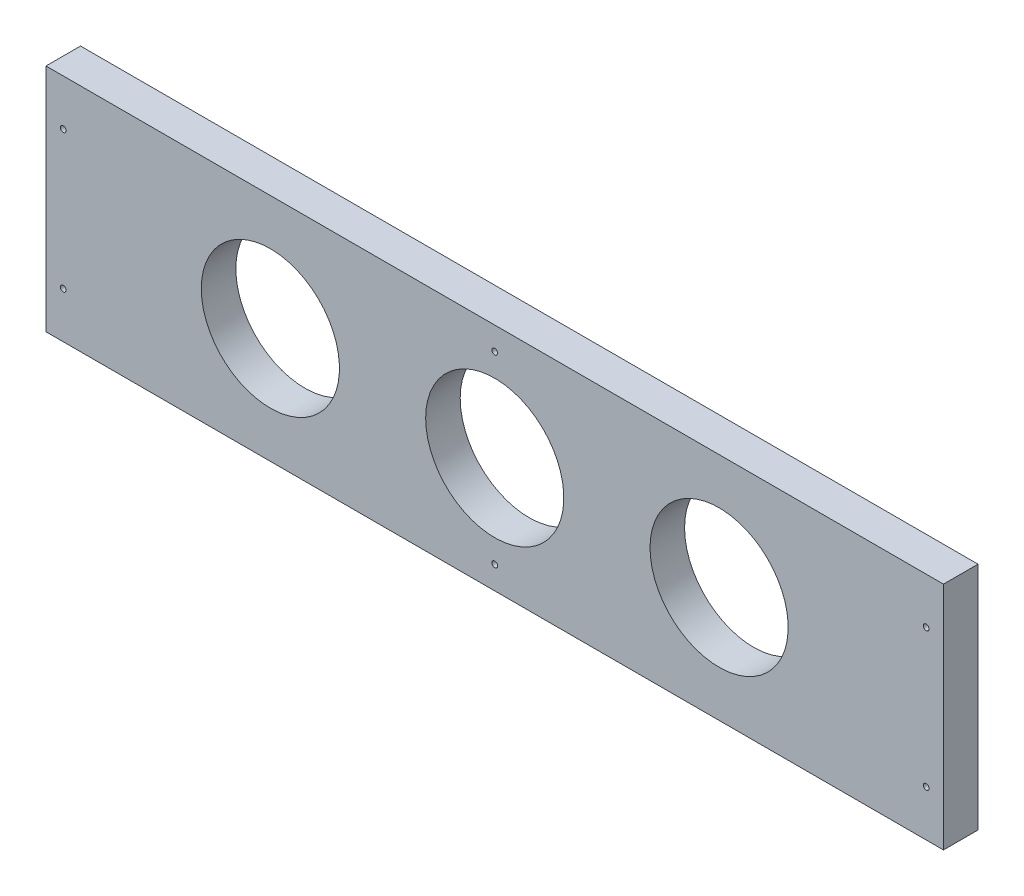
ISO-10303-21;
HEADER;
FILE_DESCRIPTION(('STEP AP214'),'2;1');
FILE_NAME('part.step','',(''),(''),'','','');
FILE_SCHEMA(('AUTOMOTIVE_DESIGN { 1 0 10303 214 1 1 1 1 }'));
ENDSEC;
DATA;
#1=APPLICATION_CONTEXT('core data for automotive mechanical design processes');
#2=APPLICATION_PROTOCOL_DEFINITION('international standard','automotive_design',2000,#1);
#3=PRODUCT_CONTEXT('',#1,'mechanical');
#4=PRODUCT('Part','Part','',(#3));
#5=PRODUCT_RELATED_PRODUCT_CATEGORY('part','',(#4));
#6=PRODUCT_DEFINITION_FORMATION('','',#4);
#7=PRODUCT_DEFINITION_CONTEXT('part definition',#1,'design');
#8=PRODUCT_DEFINITION('design','',#6,#7);
#9=PRODUCT_DEFINITION_SHAPE('','',#8);
#10=(LENGTH_UNIT() NAMED_UNIT(*) SI_UNIT(.MILLI.,.METRE.));
#11=(NAMED_UNIT(*) PLANE_ANGLE_UNIT() SI_UNIT($,.RADIAN.));
#12=(NAMED_UNIT(*) SI_UNIT($,.STERADIAN.) SOLID_ANGLE_UNIT());
#13=UNCERTAINTY_MEASURE_WITH_UNIT(LENGTH_MEASURE(1.E-05),#10,'distance_accuracy_value','');
#14=(GEOMETRIC_REPRESENTATION_CONTEXT(3) GLOBAL_UNCERTAINTY_ASSIGNED_CONTEXT((#13)) GLOBAL_UNIT_ASSIGNED_CONTEXT((#10,
#11,#12)) REPRESENTATION_CONTEXT('',''));
#15=CARTESIAN_POINT('',(0.,0.,0.));
#16=DIRECTION('',(0.,0.,1.));
#17=DIRECTION('',(1.,0.,0.));
#18=AXIS2_PLACEMENT_3D('',#15,#16,#17);
#19=CARTESIAN_POINT('',(-157.326601488341,5411.8315292923,19.05));
#20=DIRECTION('',(1.,0.,0.));
#21=DIRECTION('',(0.,0.,-1.));
#22=AXIS2_PLACEMENT_3D('',#19,#20,#21);
#23=PLANE('',#22);
#24=DIRECTION('',(0.,-1.,0.));
#25=VECTOR('',#24,1.);
#26=CARTESIAN_POINT('',(-157.326601488341,5411.8315292923,0.));
#27=LINE('',#26,#25);
#28=CARTESIAN_POINT('',(-157.326601488341,5411.8315292923,0.));
#29=VERTEX_POINT('',#28);
#30=CARTESIAN_POINT('',(-157.326601488341,5284.8315292923,0.));
#31=VERTEX_POINT('',#30);
#32=EDGE_CURVE('E98',#29,#31,#27,.T.);
#33=ORIENTED_EDGE('',*,*,#32,.T.);
#34=DIRECTION('',(0.,0.,-1.));
#35=VECTOR('',#34,1.);
#36=CARTESIAN_POINT('',(-157.326601488341,5284.8315292923,19.05));
#37=LINE('',#36,#35);
#38=CARTESIAN_POINT('',(-157.326601488341,5284.8315292923,19.05));
#39=VERTEX_POINT('',#38);
#40=EDGE_CURVE('E11',#39,#31,#37,.T.);
#41=ORIENTED_EDGE('',*,*,#40,.F.);
#42=DIRECTION('',(0.,-1.,0.));
#43=VECTOR('',#42,1.);
#44=CARTESIAN_POINT('',(-157.326601488341,5411.8315292923,19.05));
#45=LINE('',#44,#43);
#46=CARTESIAN_POINT('',(-157.326601488341,5411.8315292923,19.05));
#47=VERTEX_POINT('',#46);
#48=EDGE_CURVE('E85',#47,#39,#45,.T.);
#49=ORIENTED_EDGE('',*,*,#48,.F.);
#50=DIRECTION('',(0.,0.,-1.));
#51=VECTOR('',#50,1.);
#52=CARTESIAN_POINT('',(-157.326601488341,5411.8315292923,19.05));
#53=LINE('',#52,#51);
#54=EDGE_CURVE('E94',#47,#29,#53,.T.);
#55=ORIENTED_EDGE('',*,*,#54,.T.);
#56=EDGE_LOOP('',(#33,#41,#49,#55));
#57=FACE_BOUND('',#56,.T.);
#58=ADVANCED_FACE('F32',(#57),#23,.F.);
#59=CARTESIAN_POINT('',(-157.326601488341,5284.8315292923,19.05));
#60=DIRECTION('',(0.,1.,0.));
#61=DIRECTION('',(0.,0.,1.));
#62=AXIS2_PLACEMENT_3D('',#59,#60,#61);
#63=PLANE('',#62);
#64=DIRECTION('',(1.,0.,0.));
#65=VECTOR('',#64,1.);
#66=CARTESIAN_POINT('',(-157.326601488341,5284.8315292923,0.));
#67=LINE('',#66,#65);
#68=CARTESIAN_POINT('',(337.719398511659,5284.8315292923,0.));
#69=VERTEX_POINT('',#68);
#70=EDGE_CURVE('E89',#31,#69,#67,.T.);
#71=ORIENTED_EDGE('',*,*,#70,.T.);
#72=DIRECTION('',(0.,0.,-1.));
#73=VECTOR('',#72,1.);
#74=CARTESIAN_POINT('',(337.719398511659,5284.8315292923,19.05));
#75=LINE('',#74,#73);
#76=CARTESIAN_POINT('',(337.719398511659,5284.8315292923,19.05));
#77=VERTEX_POINT('',#76);
#78=EDGE_CURVE('E41',#77,#69,#75,.T.);
#79=ORIENTED_EDGE('',*,*,#78,.F.);
#80=DIRECTION('',(1.,0.,0.));
#81=VECTOR('',#80,1.);
#82=CARTESIAN_POINT('',(-157.326601488341,5284.8315292923,19.05));
#83=LINE('',#82,#81);
#84=EDGE_CURVE('E80',#39,#77,#83,.T.);
#85=ORIENTED_EDGE('',*,*,#84,.F.);
#86=ORIENTED_EDGE('',*,*,#40,.T.);
#87=EDGE_LOOP('',(#71,#79,#85,#86));
#88=FACE_BOUND('',#87,.T.);
#89=ADVANCED_FACE('F88',(#88),#63,.F.);
#90=CARTESIAN_POINT('',(337.719398511659,5411.8315292923,19.05));
#91=DIRECTION('',(-1.,0.,0.));
#92=DIRECTION('',(0.,0.,1.));
#93=AXIS2_PLACEMENT_3D('',#90,#91,#92);
#94=PLANE('',#93);
#95=DIRECTION('',(0.,1.,0.));
#96=VECTOR('',#95,1.);
#97=CARTESIAN_POINT('',(337.719398511659,5411.8315292923,0.));
#98=LINE('',#97,#96);
#99=CARTESIAN_POINT('',(337.719398511659,5411.8315292923,0.));
#100=VERTEX_POINT('',#99);
#101=EDGE_CURVE('E67',#69,#100,#98,.T.);
#102=ORIENTED_EDGE('',*,*,#101,.T.);
#103=DIRECTION('',(0.,0.,-1.));
#104=VECTOR('',#103,1.);
#105=CARTESIAN_POINT('',(337.719398511659,5411.8315292923,19.05));
#106=LINE('',#105,#104);
#107=CARTESIAN_POINT('',(337.719398511659,5411.8315292923,19.05));
#108=VERTEX_POINT('',#107);
#109=EDGE_CURVE('E90',#108,#100,#106,.T.);
#110=ORIENTED_EDGE('',*,*,#109,.F.);
#111=DIRECTION('',(0.,1.,0.));
#112=VECTOR('',#111,1.);
#113=CARTESIAN_POINT('',(337.719398511659,5411.8315292923,19.05));
#114=LINE('',#113,#112);
#115=EDGE_CURVE('E83',#77,#108,#114,.T.);
#116=ORIENTED_EDGE('',*,*,#115,.F.);
#117=ORIENTED_EDGE('',*,*,#78,.T.);
#118=EDGE_LOOP('',(#102,#110,#116,#117));
#119=FACE_BOUND('',#118,.T.);
#120=ADVANCED_FACE('F92',(#119),#94,.F.);
#121=CARTESIAN_POINT('',(-157.326601488341,5411.8315292923,19.05));
#122=DIRECTION('',(0.,-1.,0.));
#123=DIRECTION('',(0.,0.,-1.));
#124=AXIS2_PLACEMENT_3D('',#121,#122,#123);
#125=PLANE('',#124);
#126=DIRECTION('',(-1.,0.,0.));
#127=VECTOR('',#126,1.);
#128=CARTESIAN_POINT('',(-157.326601488341,5411.8315292923,0.));
#129=LINE('',#128,#127);
#130=EDGE_CURVE('E73',#100,#29,#129,.T.);
#131=ORIENTED_EDGE('',*,*,#130,.T.);
#132=ORIENTED_EDGE('',*,*,#54,.F.);
#133=DIRECTION('',(-1.,0.,0.));
#134=VECTOR('',#133,1.);
#135=CARTESIAN_POINT('',(-157.326601488341,5411.8315292923,19.05));
#136=LINE('',#135,#134);
#137=EDGE_CURVE('E50',#108,#47,#136,.T.);
#138=ORIENTED_EDGE('',*,*,#137,.F.);
#139=ORIENTED_EDGE('',*,*,#109,.T.);
#140=EDGE_LOOP('',(#131,#132,#138,#139));
#141=FACE_BOUND('',#140,.T.);
#142=ADVANCED_FACE('F171',(#141),#125,.F.);
#143=CARTESIAN_POINT('',(0.,0.,19.05));
#144=DIRECTION('',(0.,0.,1.));
#145=DIRECTION('',(1.,0.,0.));
#146=AXIS2_PLACEMENT_3D('',#143,#144,#145);
#147=PLANE('',#146);
#148=CARTESIAN_POINT('',(-147.801601488341,5386.4315292923,19.05));
#149=DIRECTION('',(0.,0.,1.));
#150=DIRECTION('',(1.,0.,0.));
#151=AXIS2_PLACEMENT_3D('',#148,#149,#150);
#152=CIRCLE('',#151,1.58749999999999);
#153=CARTESIAN_POINT('',(-146.214101488341,5386.4315292923,19.05));
#154=VERTEX_POINT('',#153);
#155=EDGE_CURVE('E125',#154,#154,#152,.T.);
#156=ORIENTED_EDGE('',*,*,#155,.F.);
#157=EDGE_LOOP('',(#156));
#158=FACE_BOUND('',#157,.T.);
#159=CARTESIAN_POINT('',(-147.801601488341,5310.23152929229,19.05));
#160=DIRECTION('',(0.,0.,1.));
#161=DIRECTION('',(1.,0.,0.));
#162=AXIS2_PLACEMENT_3D('',#159,#160,#161);
#163=CIRCLE('',#162,1.58749999999999);
#164=CARTESIAN_POINT('',(-146.214101488341,5310.23152929229,19.05));
#165=VERTEX_POINT('',#164);
#166=EDGE_CURVE('E122',#165,#165,#163,.T.);
#167=ORIENTED_EDGE('',*,*,#166,.F.);
#168=EDGE_LOOP('',(#167));
#169=FACE_BOUND('',#168,.T.);
#170=CARTESIAN_POINT('',(328.194398511659,5310.23152929229,19.05));
#171=DIRECTION('',(0.,0.,1.));
#172=DIRECTION('',(1.,0.,0.));
#173=AXIS2_PLACEMENT_3D('',#170,#171,#172);
#174=CIRCLE('',#173,1.58750000000002);
#175=CARTESIAN_POINT('',(329.781898511659,5310.23152929229,19.05));
#176=VERTEX_POINT('',#175);
#177=EDGE_CURVE('E119',#176,#176,#174,.T.);
#178=ORIENTED_EDGE('',*,*,#177,.F.);
#179=EDGE_LOOP('',(#178));
#180=FACE_BOUND('',#179,.T.);
#181=CARTESIAN_POINT('',(328.194398511659,5386.4315292923,19.05));
#182=DIRECTION('',(0.,0.,1.));
#183=DIRECTION('',(1.,0.,0.));
#184=AXIS2_PLACEMENT_3D('',#181,#182,#183);
#185=CIRCLE('',#184,1.58750000000002);
#186=CARTESIAN_POINT('',(329.781898511659,5386.4315292923,19.05));
#187=VERTEX_POINT('',#186);
#188=EDGE_CURVE('E115',#187,#187,#185,.T.);
#189=ORIENTED_EDGE('',*,*,#188,.F.);
#190=EDGE_LOOP('',(#189));
#191=FACE_BOUND('',#190,.T.);
#192=CARTESIAN_POINT('',(90.1963985116595,5399.1315292923,19.05));
#193=DIRECTION('',(0.,0.,1.));
#194=DIRECTION('',(1.,0.,0.));
#195=AXIS2_PLACEMENT_3D('',#192,#193,#194);
#196=CIRCLE('',#195,1.58750000000001);
#197=CARTESIAN_POINT('',(91.7838985116595,5399.1315292923,19.05));
#198=VERTEX_POINT('',#197);
#199=EDGE_CURVE('E111',#198,#198,#196,.T.);
#200=ORIENTED_EDGE('',*,*,#199,.F.);
#201=EDGE_LOOP('',(#200));
#202=FACE_BOUND('',#201,.T.);
#203=CARTESIAN_POINT('',(90.1963985116595,5297.5315292923,19.05));
#204=DIRECTION('',(0.,0.,1.));
#205=DIRECTION('',(1.,0.,0.));
#206=AXIS2_PLACEMENT_3D('',#203,#204,#205);
#207=CIRCLE('',#206,1.5875);
#208=CARTESIAN_POINT('',(91.7838985116595,5297.5315292923,19.05));
#209=VERTEX_POINT('',#208);
#210=EDGE_CURVE('E110',#209,#209,#207,.T.);
#211=ORIENTED_EDGE('',*,*,#210,.F.);
#212=EDGE_LOOP('',(#211));
#213=FACE_BOUND('',#212,.T.);
#214=CARTESIAN_POINT('',(213.957898511659,5348.3315292923,19.05));
#215=DIRECTION('',(0.,0.,-1.));
#216=DIRECTION('',(-1.,0.,0.));
#217=AXIS2_PLACEMENT_3D('',#214,#215,#216);
#218=CIRCLE('',#217,38.1000000000004);
#219=CARTESIAN_POINT('',(175.857898511659,5348.3315292923,19.05));
#220=VERTEX_POINT('',#219);
#221=EDGE_CURVE('E101',#220,#220,#218,.T.);
#222=ORIENTED_EDGE('',*,*,#221,.T.);
#223=EDGE_LOOP('',(#222));
#224=FACE_BOUND('',#223,.T.);
#225=CARTESIAN_POINT('',(90.1963985116592,5348.3315292923,19.05));
#226=DIRECTION('',(0.,0.,-1.));
#227=DIRECTION('',(-1.,0.,0.));
#228=AXIS2_PLACEMENT_3D('',#225,#226,#227);
#229=CIRCLE('',#228,38.1000000000001);
#230=CARTESIAN_POINT('',(52.0963985116591,5348.3315292923,19.05));
#231=VERTEX_POINT('',#230);
#232=EDGE_CURVE('E150',#231,#231,#229,.T.);
#233=ORIENTED_EDGE('',*,*,#232,.T.);
#234=EDGE_LOOP('',(#233));
#235=FACE_BOUND('',#234,.T.);
#236=CARTESIAN_POINT('',(-33.565101488341,5348.3315292923,19.05));
#237=DIRECTION('',(0.,0.,-1.));
#238=DIRECTION('',(1.,0.,0.));
#239=AXIS2_PLACEMENT_3D('',#236,#237,#238);
#240=CIRCLE('',#239,38.1000000000004);
#241=CARTESIAN_POINT('',(-71.6651014883413,5348.3315292923,19.05));
#242=VERTEX_POINT('',#241);
#243=EDGE_CURVE('E156',#242,#242,#240,.T.);
#244=ORIENTED_EDGE('',*,*,#243,.T.);
#245=EDGE_LOOP('',(#244));
#246=FACE_BOUND('',#245,.T.);
#247=ORIENTED_EDGE('',*,*,#48,.T.);
#248=ORIENTED_EDGE('',*,*,#84,.T.);
#249=ORIENTED_EDGE('',*,*,#115,.T.);
#250=ORIENTED_EDGE('',*,*,#137,.T.);
#251=EDGE_LOOP('',(#247,#248,#249,#250));
#252=FACE_BOUND('',#251,.T.);
#253=ADVANCED_FACE('F81',(#158,#169,#180,#191,#202,#213,#224,#235,#246,#252),#147,.T.);
#254=CARTESIAN_POINT('',(0.,0.,0.));
#255=DIRECTION('',(0.,0.,1.));
#256=DIRECTION('',(1.,0.,0.));
#257=AXIS2_PLACEMENT_3D('',#254,#255,#256);
#258=PLANE('',#257);
#259=CARTESIAN_POINT('',(-147.801601488341,5386.4315292923,0.));
#260=DIRECTION('',(0.,0.,1.));
#261=DIRECTION('',(1.,0.,0.));
#262=AXIS2_PLACEMENT_3D('',#259,#260,#261);
#263=CIRCLE('',#262,1.58749999999999);
#264=CARTESIAN_POINT('',(-146.214101488341,5386.4315292923,0.));
#265=VERTEX_POINT('',#264);
#266=EDGE_CURVE('E35',#265,#265,#263,.T.);
#267=ORIENTED_EDGE('',*,*,#266,.T.);
#268=EDGE_LOOP('',(#267));
#269=FACE_BOUND('',#268,.T.);
#270=CARTESIAN_POINT('',(-147.801601488341,5310.23152929229,0.));
#271=DIRECTION('',(0.,0.,1.));
#272=DIRECTION('',(1.,0.,0.));
#273=AXIS2_PLACEMENT_3D('',#270,#271,#272);
#274=CIRCLE('',#273,1.58749999999999);
#275=CARTESIAN_POINT('',(-146.214101488341,5310.23152929229,0.));
#276=VERTEX_POINT('',#275);
#277=EDGE_CURVE('E123',#276,#276,#274,.T.);
#278=ORIENTED_EDGE('',*,*,#277,.T.);
#279=EDGE_LOOP('',(#278));
#280=FACE_BOUND('',#279,.T.);
#281=CARTESIAN_POINT('',(328.194398511659,5310.23152929229,0.));
#282=DIRECTION('',(0.,0.,1.));
#283=DIRECTION('',(1.,0.,0.));
#284=AXIS2_PLACEMENT_3D('',#281,#282,#283);
#285=CIRCLE('',#284,1.58750000000002);
#286=CARTESIAN_POINT('',(329.781898511659,5310.23152929229,0.));
#287=VERTEX_POINT('',#286);
#288=EDGE_CURVE('E120',#287,#287,#285,.T.);
#289=ORIENTED_EDGE('',*,*,#288,.T.);
#290=EDGE_LOOP('',(#289));
#291=FACE_BOUND('',#290,.T.);
#292=CARTESIAN_POINT('',(328.194398511659,5386.4315292923,0.));
#293=DIRECTION('',(0.,0.,1.));
#294=DIRECTION('',(1.,0.,0.));
#295=AXIS2_PLACEMENT_3D('',#292,#293,#294);
#296=CIRCLE('',#295,1.58750000000002);
#297=CARTESIAN_POINT('',(329.781898511659,5386.4315292923,0.));
#298=VERTEX_POINT('',#297);
#299=EDGE_CURVE('E116',#298,#298,#296,.T.);
#300=ORIENTED_EDGE('',*,*,#299,.T.);
#301=EDGE_LOOP('',(#300));
#302=FACE_BOUND('',#301,.T.);
#303=CARTESIAN_POINT('',(90.1963985116595,5399.1315292923,0.));
#304=DIRECTION('',(0.,0.,1.));
#305=DIRECTION('',(1.,0.,0.));
#306=AXIS2_PLACEMENT_3D('',#303,#304,#305);
#307=CIRCLE('',#306,1.58750000000001);
#308=CARTESIAN_POINT('',(91.7838985116595,5399.1315292923,0.));
#309=VERTEX_POINT('',#308);
#310=EDGE_CURVE('E112',#309,#309,#307,.T.);
#311=ORIENTED_EDGE('',*,*,#310,.T.);
#312=EDGE_LOOP('',(#311));
#313=FACE_BOUND('',#312,.T.);
#314=CARTESIAN_POINT('',(90.1963985116595,5297.5315292923,0.));
#315=DIRECTION('',(0.,0.,1.));
#316=DIRECTION('',(1.,0.,0.));
#317=AXIS2_PLACEMENT_3D('',#314,#315,#316);
#318=CIRCLE('',#317,1.5875);
#319=CARTESIAN_POINT('',(91.7838985116595,5297.5315292923,0.));
#320=VERTEX_POINT('',#319);
#321=EDGE_CURVE('E107',#320,#320,#318,.T.);
#322=ORIENTED_EDGE('',*,*,#321,.T.);
#323=EDGE_LOOP('',(#322));
#324=FACE_BOUND('',#323,.T.);
#325=CARTESIAN_POINT('',(213.957898511659,5348.3315292923,0.));
#326=DIRECTION('',(0.,0.,-1.));
#327=DIRECTION('',(-1.,0.,0.));
#328=AXIS2_PLACEMENT_3D('',#325,#326,#327);
#329=CIRCLE('',#328,38.1000000000004);
#330=CARTESIAN_POINT('',(175.857898511659,5348.3315292923,0.));
#331=VERTEX_POINT('',#330);
#332=EDGE_CURVE('E147',#331,#331,#329,.T.);
#333=ORIENTED_EDGE('',*,*,#332,.F.);
#334=EDGE_LOOP('',(#333));
#335=FACE_BOUND('',#334,.T.);
#336=CARTESIAN_POINT('',(90.1963985116592,5348.3315292923,0.));
#337=DIRECTION('',(0.,0.,-1.));
#338=DIRECTION('',(-1.,0.,0.));
#339=AXIS2_PLACEMENT_3D('',#336,#337,#338);
#340=CIRCLE('',#339,38.1000000000001);
#341=CARTESIAN_POINT('',(52.0963985116591,5348.3315292923,0.));
#342=VERTEX_POINT('',#341);
#343=EDGE_CURVE('E153',#342,#342,#340,.T.);
#344=ORIENTED_EDGE('',*,*,#343,.F.);
#345=EDGE_LOOP('',(#344));
#346=FACE_BOUND('',#345,.T.);
#347=CARTESIAN_POINT('',(-33.565101488341,5348.3315292923,0.));
#348=DIRECTION('',(0.,0.,-1.));
#349=DIRECTION('',(1.,0.,0.));
#350=AXIS2_PLACEMENT_3D('',#347,#348,#349);
#351=CIRCLE('',#350,38.1000000000004);
#352=CARTESIAN_POINT('',(-71.6651014883413,5348.3315292923,0.));
#353=VERTEX_POINT('',#352);
#354=EDGE_CURVE('E144',#353,#353,#351,.T.);
#355=ORIENTED_EDGE('',*,*,#354,.F.);
#356=EDGE_LOOP('',(#355));
#357=FACE_BOUND('',#356,.T.);
#358=ORIENTED_EDGE('',*,*,#32,.F.);
#359=ORIENTED_EDGE('',*,*,#130,.F.);
#360=ORIENTED_EDGE('',*,*,#101,.F.);
#361=ORIENTED_EDGE('',*,*,#70,.F.);
#362=EDGE_LOOP('',(#358,#359,#360,#361));
#363=FACE_BOUND('',#362,.T.);
#364=ADVANCED_FACE('F164',(#269,#280,#291,#302,#313,#324,#335,#346,#357,#363),#258,.F.);
#365=CARTESIAN_POINT('',(-33.565101488341,5348.3315292923,19.05));
#366=DIRECTION('',(0.,0.,-1.));
#367=DIRECTION('',(-1.,0.,0.));
#368=AXIS2_PLACEMENT_3D('',#365,#366,#367);
#369=CYLINDRICAL_SURFACE('',#368,38.1000000000004);
#370=CARTESIAN_POINT('',(-71.6651014883413,5348.3315292923,19.05));
#371=CARTESIAN_POINT('',(-71.6651014883413,5348.3315292923,18.8515625));
#372=CARTESIAN_POINT('',(-71.6651014883413,5348.3315292923,18.653125));
#373=CARTESIAN_POINT('',(-71.6651014883413,5348.3315292923,18.25625));
#374=CARTESIAN_POINT('',(-71.6651014883413,5348.3315292923,18.0578125));
#375=CARTESIAN_POINT('',(-71.6651014883413,5348.3315292923,17.6609375));
#376=CARTESIAN_POINT('',(-71.6651014883413,5348.3315292923,17.4625));
#377=CARTESIAN_POINT('',(-71.6651014883413,5348.3315292923,17.065625));
#378=CARTESIAN_POINT('',(-71.6651014883413,5348.3315292923,16.8671875));
#379=CARTESIAN_POINT('',(-71.6651014883413,5348.3315292923,16.4703125));
#380=CARTESIAN_POINT('',(-71.6651014883413,5348.3315292923,16.271875));
#381=CARTESIAN_POINT('',(-71.6651014883413,5348.3315292923,15.875));
#382=CARTESIAN_POINT('',(-71.6651014883413,5348.3315292923,15.6765625));
#383=CARTESIAN_POINT('',(-71.6651014883413,5348.3315292923,15.2796875));
#384=CARTESIAN_POINT('',(-71.6651014883413,5348.3315292923,15.08125));
#385=CARTESIAN_POINT('',(-71.6651014883413,5348.3315292923,14.684375));
#386=CARTESIAN_POINT('',(-71.6651014883413,5348.3315292923,14.4859375));
#387=CARTESIAN_POINT('',(-71.6651014883413,5348.3315292923,14.0890625));
#388=CARTESIAN_POINT('',(-71.6651014883413,5348.3315292923,13.890625));
#389=CARTESIAN_POINT('',(-71.6651014883413,5348.3315292923,13.49375));
#390=CARTESIAN_POINT('',(-71.6651014883413,5348.3315292923,13.2953125));
#391=CARTESIAN_POINT('',(-71.6651014883413,5348.3315292923,12.8984375));
#392=CARTESIAN_POINT('',(-71.6651014883413,5348.3315292923,12.7));
#393=CARTESIAN_POINT('',(-71.6651014883413,5348.3315292923,12.303125));
#394=CARTESIAN_POINT('',(-71.6651014883413,5348.3315292923,12.1046875));
#395=CARTESIAN_POINT('',(-71.6651014883413,5348.3315292923,11.7078125));
#396=CARTESIAN_POINT('',(-71.6651014883413,5348.3315292923,11.509375));
#397=CARTESIAN_POINT('',(-71.6651014883413,5348.3315292923,11.1125));
#398=CARTESIAN_POINT('',(-71.6651014883413,5348.3315292923,10.9140625));
#399=CARTESIAN_POINT('',(-71.6651014883413,5348.3315292923,10.5171875));
#400=CARTESIAN_POINT('',(-71.6651014883413,5348.3315292923,10.31875));
#401=CARTESIAN_POINT('',(-71.6651014883413,5348.3315292923,9.921875));
#402=CARTESIAN_POINT('',(-71.6651014883413,5348.3315292923,9.7234375));
#403=CARTESIAN_POINT('',(-71.6651014883413,5348.3315292923,9.3265625));
#404=CARTESIAN_POINT('',(-71.6651014883413,5348.3315292923,9.128125));
#405=CARTESIAN_POINT('',(-71.6651014883413,5348.3315292923,8.73125));
#406=CARTESIAN_POINT('',(-71.6651014883413,5348.3315292923,8.5328125));
#407=CARTESIAN_POINT('',(-71.6651014883413,5348.3315292923,8.1359375));
#408=CARTESIAN_POINT('',(-71.6651014883413,5348.3315292923,7.9375));
#409=CARTESIAN_POINT('',(-71.6651014883413,5348.3315292923,7.540625));
#410=CARTESIAN_POINT('',(-71.6651014883413,5348.3315292923,7.3421875));
#411=CARTESIAN_POINT('',(-71.6651014883413,5348.3315292923,6.9453125));
#412=CARTESIAN_POINT('',(-71.6651014883413,5348.3315292923,6.746875));
#413=CARTESIAN_POINT('',(-71.6651014883413,5348.3315292923,6.35));
#414=CARTESIAN_POINT('',(-71.6651014883413,5348.3315292923,6.1515625));
#415=CARTESIAN_POINT('',(-71.6651014883413,5348.3315292923,5.7546875));
#416=CARTESIAN_POINT('',(-71.6651014883413,5348.3315292923,5.55625));
#417=CARTESIAN_POINT('',(-71.6651014883413,5348.3315292923,5.159375));
#418=CARTESIAN_POINT('',(-71.6651014883413,5348.3315292923,4.9609375));
#419=CARTESIAN_POINT('',(-71.6651014883413,5348.3315292923,4.5640625));
#420=CARTESIAN_POINT('',(-71.6651014883413,5348.3315292923,4.365625));
#421=CARTESIAN_POINT('',(-71.6651014883413,5348.3315292923,3.96875));
#422=CARTESIAN_POINT('',(-71.6651014883413,5348.3315292923,3.7703125));
#423=CARTESIAN_POINT('',(-71.6651014883413,5348.3315292923,3.3734375));
#424=CARTESIAN_POINT('',(-71.6651014883413,5348.3315292923,3.175));
#425=CARTESIAN_POINT('',(-71.6651014883413,5348.3315292923,2.778125));
#426=CARTESIAN_POINT('',(-71.6651014883413,5348.3315292923,2.5796875));
#427=CARTESIAN_POINT('',(-71.6651014883413,5348.3315292923,2.1828125));
#428=CARTESIAN_POINT('',(-71.6651014883413,5348.3315292923,1.984375));
#429=CARTESIAN_POINT('',(-71.6651014883413,5348.3315292923,1.5875));
#430=CARTESIAN_POINT('',(-71.6651014883413,5348.3315292923,1.3890625));
#431=CARTESIAN_POINT('',(-71.6651014883413,5348.3315292923,0.992187500000001));
#432=CARTESIAN_POINT('',(-71.6651014883413,5348.3315292923,0.793750000000001));
#433=CARTESIAN_POINT('',(-71.6651014883413,5348.3315292923,0.396875));
#434=CARTESIAN_POINT('',(-71.6651014883413,5348.3315292923,0.1984375));
#435=CARTESIAN_POINT('',(-71.6651014883413,5348.3315292923,0.));
#436=B_SPLINE_CURVE_WITH_KNOTS('',3,(#370,#371,#372,#373,#374,#375,#376,#377,#378,#379,#380,
#381,#382,#383,#384,#385,#386,#387,#388,#389,#390,#391,#392,#393,#394,#395,#396,#397,#398,#399,
#400,#401,#402,#403,#404,#405,#406,#407,#408,#409,#410,#411,#412,#413,#414,#415,#416,#417,#418,
#419,#420,#421,#422,#423,#424,#425,#426,#427,#428,#429,#430,#431,#432,#433,#434,#435),
.UNSPECIFIED.,.F.,.F.,(4,2,2,2,2,2,2,2,2,2,2,2,2,2,2,2,2,2,2,2,2,2,2,2,2,2,2,2,2,2,2,2,4),(0.,
0.5953125,1.190625,1.7859375,2.38125,2.9765625,3.571875,4.1671875,4.7625,5.3578125,5.953125,
6.5484375,7.14375,7.7390625,8.334375,8.9296875,9.525,10.1203125,10.715625,11.3109375,11.90625,
12.5015625,13.096875,13.6921875,14.2875,14.8828125,15.478125,16.0734375,16.66875,17.2640625,
17.859375,18.4546875,19.05),.UNSPECIFIED.);
#437=EDGE_CURVE('BSEAM162',#242,#353,#436,.T.);
#438=ORIENTED_EDGE('',*,*,#243,.F.);
#439=ORIENTED_EDGE('',*,*,#354,.T.);
#440=ORIENTED_EDGE('',*,*,#437,.T.);
#441=ORIENTED_EDGE('',*,*,#437,.F.);
#442=EDGE_LOOP('',(#438,#440,#439,#441));
#443=FACE_BOUND('',#442,.T.);
#444=ADVANCED_FACE('F162',(#443),#369,.F.);
#445=CARTESIAN_POINT('',(90.1963985116592,5348.3315292923,19.05));
#446=DIRECTION('',(0.,0.,-1.));
#447=DIRECTION('',(-1.,0.,0.));
#448=AXIS2_PLACEMENT_3D('',#445,#446,#447);
#449=CYLINDRICAL_SURFACE('',#448,38.1000000000001);
#450=CARTESIAN_POINT('',(52.0963985116591,5348.3315292923,19.05));
#451=CARTESIAN_POINT('',(52.0963985116591,5348.3315292923,18.8515625));
#452=CARTESIAN_POINT('',(52.0963985116591,5348.3315292923,18.653125));
#453=CARTESIAN_POINT('',(52.0963985116591,5348.3315292923,18.25625));
#454=CARTESIAN_POINT('',(52.0963985116591,5348.3315292923,18.0578125));
#455=CARTESIAN_POINT('',(52.0963985116591,5348.3315292923,17.6609375));
#456=CARTESIAN_POINT('',(52.0963985116591,5348.3315292923,17.4625));
#457=CARTESIAN_POINT('',(52.0963985116591,5348.3315292923,17.065625));
#458=CARTESIAN_POINT('',(52.0963985116591,5348.3315292923,16.8671875));
#459=CARTESIAN_POINT('',(52.0963985116591,5348.3315292923,16.4703125));
#460=CARTESIAN_POINT('',(52.0963985116591,5348.3315292923,16.271875));
#461=CARTESIAN_POINT('',(52.0963985116591,5348.3315292923,15.875));
#462=CARTESIAN_POINT('',(52.0963985116591,5348.3315292923,15.6765625));
#463=CARTESIAN_POINT('',(52.0963985116591,5348.3315292923,15.2796875));
#464=CARTESIAN_POINT('',(52.0963985116591,5348.3315292923,15.08125));
#465=CARTESIAN_POINT('',(52.0963985116591,5348.3315292923,14.684375));
#466=CARTESIAN_POINT('',(52.0963985116591,5348.3315292923,14.4859375));
#467=CARTESIAN_POINT('',(52.0963985116591,5348.3315292923,14.0890625));
#468=CARTESIAN_POINT('',(52.0963985116591,5348.3315292923,13.890625));
#469=CARTESIAN_POINT('',(52.0963985116591,5348.3315292923,13.49375));
#470=CARTESIAN_POINT('',(52.0963985116591,5348.3315292923,13.2953125));
#471=CARTESIAN_POINT('',(52.0963985116591,5348.3315292923,12.8984375));
#472=CARTESIAN_POINT('',(52.0963985116591,5348.3315292923,12.7));
#473=CARTESIAN_POINT('',(52.0963985116591,5348.3315292923,12.303125));
#474=CARTESIAN_POINT('',(52.0963985116591,5348.3315292923,12.1046875));
#475=CARTESIAN_POINT('',(52.0963985116591,5348.3315292923,11.7078125));
#476=CARTESIAN_POINT('',(52.0963985116591,5348.3315292923,11.509375));
#477=CARTESIAN_POINT('',(52.0963985116591,5348.3315292923,11.1125));
#478=CARTESIAN_POINT('',(52.0963985116591,5348.3315292923,10.9140625));
#479=CARTESIAN_POINT('',(52.0963985116591,5348.3315292923,10.5171875));
#480=CARTESIAN_POINT('',(52.0963985116591,5348.3315292923,10.31875));
#481=CARTESIAN_POINT('',(52.0963985116591,5348.3315292923,9.921875));
#482=CARTESIAN_POINT('',(52.0963985116591,5348.3315292923,9.7234375));
#483=CARTESIAN_POINT('',(52.0963985116591,5348.3315292923,9.3265625));
#484=CARTESIAN_POINT('',(52.0963985116591,5348.3315292923,9.128125));
#485=CARTESIAN_POINT('',(52.0963985116591,5348.3315292923,8.73125));
#486=CARTESIAN_POINT('',(52.0963985116591,5348.3315292923,8.5328125));
#487=CARTESIAN_POINT('',(52.0963985116591,5348.3315292923,8.1359375));
#488=CARTESIAN_POINT('',(52.0963985116591,5348.3315292923,7.9375));
#489=CARTESIAN_POINT('',(52.0963985116591,5348.3315292923,7.540625));
#490=CARTESIAN_POINT('',(52.0963985116591,5348.3315292923,7.3421875));
#491=CARTESIAN_POINT('',(52.0963985116591,5348.3315292923,6.9453125));
#492=CARTESIAN_POINT('',(52.0963985116591,5348.3315292923,6.746875));
#493=CARTESIAN_POINT('',(52.0963985116591,5348.3315292923,6.35));
#494=CARTESIAN_POINT('',(52.0963985116591,5348.3315292923,6.1515625));
#495=CARTESIAN_POINT('',(52.0963985116591,5348.3315292923,5.7546875));
#496=CARTESIAN_POINT('',(52.0963985116591,5348.3315292923,5.55625));
#497=CARTESIAN_POINT('',(52.0963985116591,5348.3315292923,5.159375));
#498=CARTESIAN_POINT('',(52.0963985116591,5348.3315292923,4.9609375));
#499=CARTESIAN_POINT('',(52.0963985116591,5348.3315292923,4.5640625));
#500=CARTESIAN_POINT('',(52.0963985116591,5348.3315292923,4.365625));
#501=CARTESIAN_POINT('',(52.0963985116591,5348.3315292923,3.96875));
#502=CARTESIAN_POINT('',(52.0963985116591,5348.3315292923,3.7703125));
#503=CARTESIAN_POINT('',(52.0963985116591,5348.3315292923,3.3734375));
#504=CARTESIAN_POINT('',(52.0963985116591,5348.3315292923,3.175));
#505=CARTESIAN_POINT('',(52.0963985116591,5348.3315292923,2.778125));
#506=CARTESIAN_POINT('',(52.0963985116591,5348.3315292923,2.5796875));
#507=CARTESIAN_POINT('',(52.0963985116591,5348.3315292923,2.1828125));
#508=CARTESIAN_POINT('',(52.0963985116591,5348.3315292923,1.984375));
#509=CARTESIAN_POINT('',(52.0963985116591,5348.3315292923,1.5875));
#510=CARTESIAN_POINT('',(52.0963985116591,5348.3315292923,1.3890625));
#511=CARTESIAN_POINT('',(52.0963985116591,5348.3315292923,0.992187500000001));
#512=CARTESIAN_POINT('',(52.0963985116591,5348.3315292923,0.793750000000001));
#513=CARTESIAN_POINT('',(52.0963985116591,5348.3315292923,0.396875));
#514=CARTESIAN_POINT('',(52.0963985116591,5348.3315292923,0.1984375));
#515=CARTESIAN_POINT('',(52.0963985116591,5348.3315292923,0.));
#516=B_SPLINE_CURVE_WITH_KNOTS('',3,(#450,#451,#452,#453,#454,#455,#456,#457,#458,#459,#460,
#461,#462,#463,#464,#465,#466,#467,#468,#469,#470,#471,#472,#473,#474,#475,#476,#477,#478,#479,
#480,#481,#482,#483,#484,#485,#486,#487,#488,#489,#490,#491,#492,#493,#494,#495,#496,#497,#498,
#499,#500,#501,#502,#503,#504,#505,#506,#507,#508,#509,#510,#511,#512,#513,#514,#515),
.UNSPECIFIED.,.F.,.F.,(4,2,2,2,2,2,2,2,2,2,2,2,2,2,2,2,2,2,2,2,2,2,2,2,2,2,2,2,2,2,2,2,4),(0.,
0.5953125,1.190625,1.7859375,2.38125,2.9765625,3.571875,4.1671875,4.7625,5.3578125,5.953125,
6.5484375,7.14375,7.7390625,8.334375,8.9296875,9.525,10.1203125,10.715625,11.3109375,11.90625,
12.5015625,13.096875,13.6921875,14.2875,14.8828125,15.478125,16.0734375,16.66875,17.2640625,
17.859375,18.4546875,19.05),.UNSPECIFIED.);
#517=EDGE_CURVE('BSEAM205',#231,#342,#516,.T.);
#518=ORIENTED_EDGE('',*,*,#232,.F.);
#519=ORIENTED_EDGE('',*,*,#343,.T.);
#520=ORIENTED_EDGE('',*,*,#517,.T.);
#521=ORIENTED_EDGE('',*,*,#517,.F.);
#522=EDGE_LOOP('',(#518,#520,#519,#521));
#523=FACE_BOUND('',#522,.T.);
#524=ADVANCED_FACE('F205',(#523),#449,.F.);
#525=CARTESIAN_POINT('',(213.957898511659,5348.3315292923,19.05));
#526=DIRECTION('',(0.,0.,-1.));
#527=DIRECTION('',(-1.,0.,0.));
#528=AXIS2_PLACEMENT_3D('',#525,#526,#527);
#529=CYLINDRICAL_SURFACE('',#528,38.1000000000004);
#530=CARTESIAN_POINT('',(175.857898511659,5348.3315292923,19.05));
#531=CARTESIAN_POINT('',(175.857898511659,5348.3315292923,18.8515625));
#532=CARTESIAN_POINT('',(175.857898511659,5348.3315292923,18.653125));
#533=CARTESIAN_POINT('',(175.857898511659,5348.3315292923,18.25625));
#534=CARTESIAN_POINT('',(175.857898511659,5348.3315292923,18.0578125));
#535=CARTESIAN_POINT('',(175.857898511659,5348.3315292923,17.6609375));
#536=CARTESIAN_POINT('',(175.857898511659,5348.3315292923,17.4625));
#537=CARTESIAN_POINT('',(175.857898511659,5348.3315292923,17.065625));
#538=CARTESIAN_POINT('',(175.857898511659,5348.3315292923,16.8671875));
#539=CARTESIAN_POINT('',(175.857898511659,5348.3315292923,16.4703125));
#540=CARTESIAN_POINT('',(175.857898511659,5348.3315292923,16.271875));
#541=CARTESIAN_POINT('',(175.857898511659,5348.3315292923,15.875));
#542=CARTESIAN_POINT('',(175.857898511659,5348.3315292923,15.6765625));
#543=CARTESIAN_POINT('',(175.857898511659,5348.3315292923,15.2796875));
#544=CARTESIAN_POINT('',(175.857898511659,5348.3315292923,15.08125));
#545=CARTESIAN_POINT('',(175.857898511659,5348.3315292923,14.684375));
#546=CARTESIAN_POINT('',(175.857898511659,5348.3315292923,14.4859375));
#547=CARTESIAN_POINT('',(175.857898511659,5348.3315292923,14.0890625));
#548=CARTESIAN_POINT('',(175.857898511659,5348.3315292923,13.890625));
#549=CARTESIAN_POINT('',(175.857898511659,5348.3315292923,13.49375));
#550=CARTESIAN_POINT('',(175.857898511659,5348.3315292923,13.2953125));
#551=CARTESIAN_POINT('',(175.857898511659,5348.3315292923,12.8984375));
#552=CARTESIAN_POINT('',(175.857898511659,5348.3315292923,12.7));
#553=CARTESIAN_POINT('',(175.857898511659,5348.3315292923,12.303125));
#554=CARTESIAN_POINT('',(175.857898511659,5348.3315292923,12.1046875));
#555=CARTESIAN_POINT('',(175.857898511659,5348.3315292923,11.7078125));
#556=CARTESIAN_POINT('',(175.857898511659,5348.3315292923,11.509375));
#557=CARTESIAN_POINT('',(175.857898511659,5348.3315292923,11.1125));
#558=CARTESIAN_POINT('',(175.857898511659,5348.3315292923,10.9140625));
#559=CARTESIAN_POINT('',(175.857898511659,5348.3315292923,10.5171875));
#560=CARTESIAN_POINT('',(175.857898511659,5348.3315292923,10.31875));
#561=CARTESIAN_POINT('',(175.857898511659,5348.3315292923,9.921875));
#562=CARTESIAN_POINT('',(175.857898511659,5348.3315292923,9.7234375));
#563=CARTESIAN_POINT('',(175.857898511659,5348.3315292923,9.3265625));
#564=CARTESIAN_POINT('',(175.857898511659,5348.3315292923,9.128125));
#565=CARTESIAN_POINT('',(175.857898511659,5348.3315292923,8.73125));
#566=CARTESIAN_POINT('',(175.857898511659,5348.3315292923,8.5328125));
#567=CARTESIAN_POINT('',(175.857898511659,5348.3315292923,8.1359375));
#568=CARTESIAN_POINT('',(175.857898511659,5348.3315292923,7.9375));
#569=CARTESIAN_POINT('',(175.857898511659,5348.3315292923,7.540625));
#570=CARTESIAN_POINT('',(175.857898511659,5348.3315292923,7.3421875));
#571=CARTESIAN_POINT('',(175.857898511659,5348.3315292923,6.9453125));
#572=CARTESIAN_POINT('',(175.857898511659,5348.3315292923,6.746875));
#573=CARTESIAN_POINT('',(175.857898511659,5348.3315292923,6.35));
#574=CARTESIAN_POINT('',(175.857898511659,5348.3315292923,6.1515625));
#575=CARTESIAN_POINT('',(175.857898511659,5348.3315292923,5.7546875));
#576=CARTESIAN_POINT('',(175.857898511659,5348.3315292923,5.55625));
#577=CARTESIAN_POINT('',(175.857898511659,5348.3315292923,5.159375));
#578=CARTESIAN_POINT('',(175.857898511659,5348.3315292923,4.9609375));
#579=CARTESIAN_POINT('',(175.857898511659,5348.3315292923,4.5640625));
#580=CARTESIAN_POINT('',(175.857898511659,5348.3315292923,4.365625));
#581=CARTESIAN_POINT('',(175.857898511659,5348.3315292923,3.96875));
#582=CARTESIAN_POINT('',(175.857898511659,5348.3315292923,3.7703125));
#583=CARTESIAN_POINT('',(175.857898511659,5348.3315292923,3.3734375));
#584=CARTESIAN_POINT('',(175.857898511659,5348.3315292923,3.175));
#585=CARTESIAN_POINT('',(175.857898511659,5348.3315292923,2.778125));
#586=CARTESIAN_POINT('',(175.857898511659,5348.3315292923,2.5796875));
#587=CARTESIAN_POINT('',(175.857898511659,5348.3315292923,2.1828125));
#588=CARTESIAN_POINT('',(175.857898511659,5348.3315292923,1.984375));
#589=CARTESIAN_POINT('',(175.857898511659,5348.3315292923,1.5875));
#590=CARTESIAN_POINT('',(175.857898511659,5348.3315292923,1.3890625));
#591=CARTESIAN_POINT('',(175.857898511659,5348.3315292923,0.992187500000001));
#592=CARTESIAN_POINT('',(175.857898511659,5348.3315292923,0.793750000000001));
#593=CARTESIAN_POINT('',(175.857898511659,5348.3315292923,0.396875));
#594=CARTESIAN_POINT('',(175.857898511659,5348.3315292923,0.1984375));
#595=CARTESIAN_POINT('',(175.857898511659,5348.3315292923,0.));
#596=B_SPLINE_CURVE_WITH_KNOTS('',3,(#530,#531,#532,#533,#534,#535,#536,#537,#538,#539,#540,
#541,#542,#543,#544,#545,#546,#547,#548,#549,#550,#551,#552,#553,#554,#555,#556,#557,#558,#559,
#560,#561,#562,#563,#564,#565,#566,#567,#568,#569,#570,#571,#572,#573,#574,#575,#576,#577,#578,
#579,#580,#581,#582,#583,#584,#585,#586,#587,#588,#589,#590,#591,#592,#593,#594,#595),
.UNSPECIFIED.,.F.,.F.,(4,2,2,2,2,2,2,2,2,2,2,2,2,2,2,2,2,2,2,2,2,2,2,2,2,2,2,2,2,2,2,2,4),(0.,
0.5953125,1.190625,1.7859375,2.38125,2.9765625,3.571875,4.1671875,4.7625,5.3578125,5.953125,
6.5484375,7.14375,7.7390625,8.334375,8.9296875,9.525,10.1203125,10.715625,11.3109375,11.90625,
12.5015625,13.096875,13.6921875,14.2875,14.8828125,15.478125,16.0734375,16.66875,17.2640625,
17.859375,18.4546875,19.05),.UNSPECIFIED.);
#597=EDGE_CURVE('BSEAM216',#220,#331,#596,.T.);
#598=ORIENTED_EDGE('',*,*,#221,.F.);
#599=ORIENTED_EDGE('',*,*,#332,.T.);
#600=ORIENTED_EDGE('',*,*,#597,.T.);
#601=ORIENTED_EDGE('',*,*,#597,.F.);
#602=EDGE_LOOP('',(#598,#600,#599,#601));
#603=FACE_BOUND('',#602,.T.);
#604=ADVANCED_FACE('F216',(#603),#529,.F.);
#605=CARTESIAN_POINT('',(90.1963985116595,5297.5315292923,38.0999999999982));
#606=DIRECTION('',(0.,0.,1.));
#607=DIRECTION('',(1.,0.,0.));
#608=AXIS2_PLACEMENT_3D('',#605,#606,#607);
#609=CYLINDRICAL_SURFACE('',#608,1.5875);
#610=ORIENTED_EDGE('',*,*,#210,.T.);
#611=EDGE_LOOP('',(#610));
#612=FACE_BOUND('',#611,.T.);
#613=ORIENTED_EDGE('',*,*,#321,.F.);
#614=EDGE_LOOP('',(#613));
#615=FACE_BOUND('',#614,.T.);
#616=ADVANCED_FACE('F226',(#612,#615),#609,.F.);
#617=CARTESIAN_POINT('',(90.1963985116595,5399.1315292923,38.0999999999982));
#618=DIRECTION('',(0.,0.,1.));
#619=DIRECTION('',(1.,0.,0.));
#620=AXIS2_PLACEMENT_3D('',#617,#618,#619);
#621=CYLINDRICAL_SURFACE('',#620,1.58750000000001);
#622=ORIENTED_EDGE('',*,*,#199,.T.);
#623=EDGE_LOOP('',(#622));
#624=FACE_BOUND('',#623,.T.);
#625=ORIENTED_EDGE('',*,*,#310,.F.);
#626=EDGE_LOOP('',(#625));
#627=FACE_BOUND('',#626,.T.);
#628=ADVANCED_FACE('F246',(#624,#627),#621,.F.);
#629=CARTESIAN_POINT('',(328.194398511659,5386.4315292923,38.0999999999982));
#630=DIRECTION('',(0.,0.,1.));
#631=DIRECTION('',(1.,0.,0.));
#632=AXIS2_PLACEMENT_3D('',#629,#630,#631);
#633=CYLINDRICAL_SURFACE('',#632,1.58750000000002);
#634=ORIENTED_EDGE('',*,*,#188,.T.);
#635=EDGE_LOOP('',(#634));
#636=FACE_BOUND('',#635,.T.);
#637=ORIENTED_EDGE('',*,*,#299,.F.);
#638=EDGE_LOOP('',(#637));
#639=FACE_BOUND('',#638,.T.);
#640=ADVANCED_FACE('F256',(#636,#639),#633,.F.);
#641=CARTESIAN_POINT('',(328.194398511659,5310.23152929229,38.0999999999982));
#642=DIRECTION('',(0.,0.,1.));
#643=DIRECTION('',(1.,0.,0.));
#644=AXIS2_PLACEMENT_3D('',#641,#642,#643);
#645=CYLINDRICAL_SURFACE('',#644,1.58750000000002);
#646=ORIENTED_EDGE('',*,*,#177,.T.);
#647=EDGE_LOOP('',(#646));
#648=FACE_BOUND('',#647,.T.);
#649=ORIENTED_EDGE('',*,*,#288,.F.);
#650=EDGE_LOOP('',(#649));
#651=FACE_BOUND('',#650,.T.);
#652=ADVANCED_FACE('F266',(#648,#651),#645,.F.);
#653=CARTESIAN_POINT('',(-147.801601488341,5310.23152929229,38.0999999999982));
#654=DIRECTION('',(0.,0.,1.));
#655=DIRECTION('',(1.,0.,0.));
#656=AXIS2_PLACEMENT_3D('',#653,#654,#655);
#657=CYLINDRICAL_SURFACE('',#656,1.58749999999999);
#658=ORIENTED_EDGE('',*,*,#166,.T.);
#659=EDGE_LOOP('',(#658));
#660=FACE_BOUND('',#659,.T.);
#661=ORIENTED_EDGE('',*,*,#277,.F.);
#662=EDGE_LOOP('',(#661));
#663=FACE_BOUND('',#662,.T.);
#664=ADVANCED_FACE('F276',(#660,#663),#657,.F.);
#665=CARTESIAN_POINT('',(-147.801601488341,5386.4315292923,38.0999999999982));
#666=DIRECTION('',(0.,0.,1.));
#667=DIRECTION('',(1.,0.,0.));
#668=AXIS2_PLACEMENT_3D('',#665,#666,#667);
#669=CYLINDRICAL_SURFACE('',#668,1.58749999999999);
#670=ORIENTED_EDGE('',*,*,#155,.T.);
#671=EDGE_LOOP('',(#670));
#672=FACE_BOUND('',#671,.T.);
#673=ORIENTED_EDGE('',*,*,#266,.F.);
#674=EDGE_LOOP('',(#673));
#675=FACE_BOUND('',#674,.T.);
#676=ADVANCED_FACE('F286',(#672,#675),#669,.F.);
#677=CLOSED_SHELL('',(#58,#89,#120,#142,#253,#364,#444,#524,#604,#616,#628,#640,#652,#664,#676));
#678=MANIFOLD_SOLID_BREP('B2',#677);
#679=ADVANCED_BREP_SHAPE_REPRESENTATION('',(#18,#678),#14);
#680=SHAPE_DEFINITION_REPRESENTATION(#9,#679);
ENDSEC;
END-ISO-10303-21;
